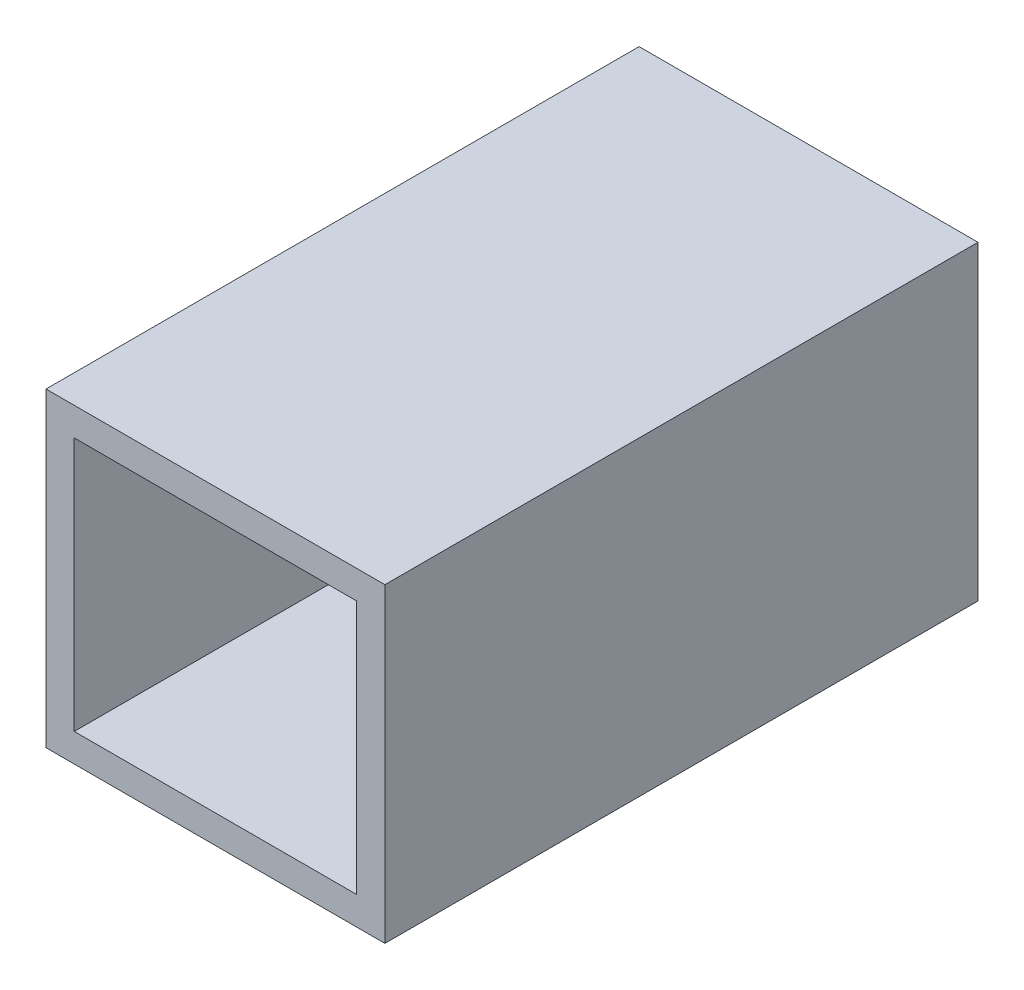
ISO-10303-21;
HEADER;
FILE_DESCRIPTION(('STEP AP214'),'2;1');
FILE_NAME('part.step','',(''),(''),'','','');
FILE_SCHEMA(('AUTOMOTIVE_DESIGN { 1 0 10303 214 1 1 1 1 }'));
ENDSEC;
DATA;
#1=APPLICATION_CONTEXT('core data for automotive mechanical design processes');
#2=APPLICATION_PROTOCOL_DEFINITION('international standard','automotive_design',2000,#1);
#3=PRODUCT_CONTEXT('',#1,'mechanical');
#4=PRODUCT('Part','Part','',(#3));
#5=PRODUCT_RELATED_PRODUCT_CATEGORY('part','',(#4));
#6=PRODUCT_DEFINITION_FORMATION('','',#4);
#7=PRODUCT_DEFINITION_CONTEXT('part definition',#1,'design');
#8=PRODUCT_DEFINITION('design','',#6,#7);
#9=PRODUCT_DEFINITION_SHAPE('','',#8);
#10=(LENGTH_UNIT() NAMED_UNIT(*) SI_UNIT(.MILLI.,.METRE.));
#11=(NAMED_UNIT(*) PLANE_ANGLE_UNIT() SI_UNIT($,.RADIAN.));
#12=(NAMED_UNIT(*) SI_UNIT($,.STERADIAN.) SOLID_ANGLE_UNIT());
#13=UNCERTAINTY_MEASURE_WITH_UNIT(LENGTH_MEASURE(1.E-05),#10,'distance_accuracy_value','');
#14=(GEOMETRIC_REPRESENTATION_CONTEXT(3) GLOBAL_UNCERTAINTY_ASSIGNED_CONTEXT((#13)) GLOBAL_UNIT_ASSIGNED_CONTEXT((#10,
#11,#12)) REPRESENTATION_CONTEXT('',''));
#15=CARTESIAN_POINT('',(0.,0.,0.));
#16=DIRECTION('',(0.,0.,1.));
#17=DIRECTION('',(1.,0.,0.));
#18=AXIS2_PLACEMENT_3D('',#15,#16,#17);
#19=CARTESIAN_POINT('',(25.,-22.5,-105.));
#20=DIRECTION('',(1.,0.,0.));
#21=DIRECTION('',(0.,0.,-1.));
#22=AXIS2_PLACEMENT_3D('',#19,#20,#21);
#23=PLANE('',#22);
#24=DIRECTION('',(0.,-1.,0.));
#25=VECTOR('',#24,1.);
#26=CARTESIAN_POINT('',(25.,-12.5,-100.));
#27=LINE('',#26,#25);
#28=CARTESIAN_POINT('',(25.,-12.5,-100.));
#29=VERTEX_POINT('',#28);
#30=CARTESIAN_POINT('',(25.,-22.5,-100.));
#31=VERTEX_POINT('',#30);
#32=EDGE_CURVE('E117',#29,#31,#27,.T.);
#33=ORIENTED_EDGE('',*,*,#32,.T.);
#34=DIRECTION('',(0.,0.,1.));
#35=VECTOR('',#34,1.);
#36=CARTESIAN_POINT('',(25.,-22.5,-105.));
#37=LINE('',#36,#35);
#38=CARTESIAN_POINT('',(25.,-22.5,0.));
#39=VERTEX_POINT('',#38);
#40=EDGE_CURVE('E150',#31,#39,#37,.T.);
#41=ORIENTED_EDGE('',*,*,#40,.T.);
#42=DIRECTION('',(0.,1.,0.));
#43=VECTOR('',#42,1.);
#44=CARTESIAN_POINT('',(25.,-22.5,0.));
#45=LINE('',#44,#43);
#46=CARTESIAN_POINT('',(25.,22.5,0.));
#47=VERTEX_POINT('',#46);
#48=EDGE_CURVE('E129',#39,#47,#45,.T.);
#49=ORIENTED_EDGE('',*,*,#48,.T.);
#50=DIRECTION('',(0.,0.,1.));
#51=VECTOR('',#50,1.);
#52=CARTESIAN_POINT('',(25.,22.5,-105.));
#53=LINE('',#52,#51);
#54=CARTESIAN_POINT('',(25.,22.5,-105.));
#55=VERTEX_POINT('',#54);
#56=EDGE_CURVE('E142',#55,#47,#53,.T.);
#57=ORIENTED_EDGE('',*,*,#56,.F.);
#58=DIRECTION('',(0.,1.,0.));
#59=VECTOR('',#58,1.);
#60=CARTESIAN_POINT('',(25.,-22.5,-105.));
#61=LINE('',#60,#59);
#62=CARTESIAN_POINT('',(25.,-12.5,-105.));
#63=VERTEX_POINT('',#62);
#64=EDGE_CURVE('E136',#63,#55,#61,.T.);
#65=ORIENTED_EDGE('',*,*,#64,.F.);
#66=DIRECTION('',(0.,0.,-1.));
#67=VECTOR('',#66,1.);
#68=CARTESIAN_POINT('',(25.,-12.5,-105.));
#69=LINE('',#68,#67);
#70=EDGE_CURVE('E119',#29,#63,#69,.T.);
#71=ORIENTED_EDGE('',*,*,#70,.F.);
#72=EDGE_LOOP('',(#33,#41,#49,#57,#65,#71));
#73=FACE_BOUND('',#72,.T.);
#74=ADVANCED_FACE('F33',(#73),#23,.F.);
#75=CARTESIAN_POINT('',(25.,-22.5,-105.));
#76=DIRECTION('',(0.,-1.,0.));
#77=DIRECTION('',(1.,0.,0.));
#78=AXIS2_PLACEMENT_3D('',#75,#76,#77);
#79=PLANE('',#78);
#80=DIRECTION('',(1.,0.,0.));
#81=VECTOR('',#80,1.);
#82=CARTESIAN_POINT('',(-25.,-22.5,-100.));
#83=LINE('',#82,#81);
#84=CARTESIAN_POINT('',(-25.,-22.5,-100.));
#85=VERTEX_POINT('',#84);
#86=EDGE_CURVE('E123',#85,#31,#83,.T.);
#87=ORIENTED_EDGE('',*,*,#86,.F.);
#88=DIRECTION('',(0.,0.,1.));
#89=VECTOR('',#88,1.);
#90=CARTESIAN_POINT('',(-25.,-22.5,-105.));
#91=LINE('',#90,#89);
#92=CARTESIAN_POINT('',(-25.,-22.5,0.));
#93=VERTEX_POINT('',#92);
#94=EDGE_CURVE('E128',#85,#93,#91,.T.);
#95=ORIENTED_EDGE('',*,*,#94,.T.);
#96=DIRECTION('',(1.,0.,0.));
#97=VECTOR('',#96,1.);
#98=CARTESIAN_POINT('',(25.,-22.5,0.));
#99=LINE('',#98,#97);
#100=EDGE_CURVE('E139',#93,#39,#99,.T.);
#101=ORIENTED_EDGE('',*,*,#100,.T.);
#102=ORIENTED_EDGE('',*,*,#40,.F.);
#103=EDGE_LOOP('',(#87,#95,#101,#102));
#104=FACE_BOUND('',#103,.T.);
#105=ADVANCED_FACE('F210',(#104),#79,.F.);
#106=CARTESIAN_POINT('',(-25.,-22.5,-105.));
#107=DIRECTION('',(-1.,0.,0.));
#108=DIRECTION('',(0.,0.,1.));
#109=AXIS2_PLACEMENT_3D('',#106,#107,#108);
#110=PLANE('',#109);
#111=DIRECTION('',(0.,-1.,0.));
#112=VECTOR('',#111,1.);
#113=CARTESIAN_POINT('',(-25.,-12.5,-100.));
#114=LINE('',#113,#112);
#115=CARTESIAN_POINT('',(-25.,-12.5,-100.));
#116=VERTEX_POINT('',#115);
#117=EDGE_CURVE('E114',#116,#85,#114,.T.);
#118=ORIENTED_EDGE('',*,*,#117,.F.);
#119=DIRECTION('',(0.,0.,1.));
#120=VECTOR('',#119,1.);
#121=CARTESIAN_POINT('',(-25.,-12.5,-105.));
#122=LINE('',#121,#120);
#123=CARTESIAN_POINT('',(-25.,-12.5,-105.));
#124=VERTEX_POINT('',#123);
#125=EDGE_CURVE('E120',#124,#116,#122,.T.);
#126=ORIENTED_EDGE('',*,*,#125,.F.);
#127=DIRECTION('',(0.,-1.,0.));
#128=VECTOR('',#127,1.);
#129=CARTESIAN_POINT('',(-25.,-22.5,-105.));
#130=LINE('',#129,#128);
#131=CARTESIAN_POINT('',(-25.,22.5,-105.));
#132=VERTEX_POINT('',#131);
#133=EDGE_CURVE('E57',#132,#124,#130,.T.);
#134=ORIENTED_EDGE('',*,*,#133,.F.);
#135=DIRECTION('',(0.,0.,1.));
#136=VECTOR('',#135,1.);
#137=CARTESIAN_POINT('',(-25.,22.5,-105.));
#138=LINE('',#137,#136);
#139=CARTESIAN_POINT('',(-25.,22.5,0.));
#140=VERTEX_POINT('',#139);
#141=EDGE_CURVE('E154',#132,#140,#138,.T.);
#142=ORIENTED_EDGE('',*,*,#141,.T.);
#143=DIRECTION('',(0.,-1.,0.));
#144=VECTOR('',#143,1.);
#145=CARTESIAN_POINT('',(-25.,-22.5,0.));
#146=LINE('',#145,#144);
#147=EDGE_CURVE('E146',#140,#93,#146,.T.);
#148=ORIENTED_EDGE('',*,*,#147,.T.);
#149=ORIENTED_EDGE('',*,*,#94,.F.);
#150=EDGE_LOOP('',(#118,#126,#134,#142,#148,#149));
#151=FACE_BOUND('',#150,.T.);
#152=ADVANCED_FACE('F126',(#151),#110,.F.);
#153=CARTESIAN_POINT('',(-30.,-27.5,-105.));
#154=DIRECTION('',(-1.,0.,0.));
#155=DIRECTION('',(0.,0.,1.));
#156=AXIS2_PLACEMENT_3D('',#153,#154,#155);
#157=PLANE('',#156);
#158=DIRECTION('',(0.,-1.,0.));
#159=VECTOR('',#158,1.);
#160=CARTESIAN_POINT('',(-30.,-27.5,0.));
#161=LINE('',#160,#159);
#162=CARTESIAN_POINT('',(-30.,27.5,0.));
#163=VERTEX_POINT('',#162);
#164=CARTESIAN_POINT('',(-30.,-27.5,0.));
#165=VERTEX_POINT('',#164);
#166=EDGE_CURVE('E152',#163,#165,#161,.T.);
#167=ORIENTED_EDGE('',*,*,#166,.F.);
#168=DIRECTION('',(0.,0.,1.));
#169=VECTOR('',#168,1.);
#170=CARTESIAN_POINT('',(-30.,27.5,-105.));
#171=LINE('',#170,#169);
#172=CARTESIAN_POINT('',(-30.,27.5,-105.));
#173=VERTEX_POINT('',#172);
#174=EDGE_CURVE('E11',#173,#163,#171,.T.);
#175=ORIENTED_EDGE('',*,*,#174,.F.);
#176=DIRECTION('',(0.,-1.,0.));
#177=VECTOR('',#176,1.);
#178=CARTESIAN_POINT('',(-30.,-27.5,-105.));
#179=LINE('',#178,#177);
#180=CARTESIAN_POINT('',(-30.,-27.5,-105.));
#181=VERTEX_POINT('',#180);
#182=EDGE_CURVE('E158',#173,#181,#179,.T.);
#183=ORIENTED_EDGE('',*,*,#182,.T.);
#184=DIRECTION('',(0.,0.,1.));
#185=VECTOR('',#184,1.);
#186=CARTESIAN_POINT('',(-30.,-27.5,-105.));
#187=LINE('',#186,#185);
#188=EDGE_CURVE('E37',#181,#165,#187,.T.);
#189=ORIENTED_EDGE('',*,*,#188,.T.);
#190=EDGE_LOOP('',(#167,#175,#183,#189));
#191=FACE_BOUND('',#190,.T.);
#192=ADVANCED_FACE('F35',(#191),#157,.T.);
#193=CARTESIAN_POINT('',(30.,27.5,-105.));
#194=DIRECTION('',(0.,1.,0.));
#195=DIRECTION('',(0.,0.,1.));
#196=AXIS2_PLACEMENT_3D('',#193,#194,#195);
#197=PLANE('',#196);
#198=DIRECTION('',(-1.,0.,0.));
#199=VECTOR('',#198,1.);
#200=CARTESIAN_POINT('',(30.,27.5,0.));
#201=LINE('',#200,#199);
#202=CARTESIAN_POINT('',(30.,27.5,0.));
#203=VERTEX_POINT('',#202);
#204=EDGE_CURVE('E162',#203,#163,#201,.T.);
#205=ORIENTED_EDGE('',*,*,#204,.F.);
#206=DIRECTION('',(0.,0.,1.));
#207=VECTOR('',#206,1.);
#208=CARTESIAN_POINT('',(30.,27.5,-105.));
#209=LINE('',#208,#207);
#210=CARTESIAN_POINT('',(30.,27.5,-105.));
#211=VERTEX_POINT('',#210);
#212=EDGE_CURVE('E42',#211,#203,#209,.T.);
#213=ORIENTED_EDGE('',*,*,#212,.F.);
#214=DIRECTION('',(-1.,0.,0.));
#215=VECTOR('',#214,1.);
#216=CARTESIAN_POINT('',(30.,27.5,-105.));
#217=LINE('',#216,#215);
#218=EDGE_CURVE('E168',#211,#173,#217,.T.);
#219=ORIENTED_EDGE('',*,*,#218,.T.);
#220=ORIENTED_EDGE('',*,*,#174,.T.);
#221=EDGE_LOOP('',(#205,#213,#219,#220));
#222=FACE_BOUND('',#221,.T.);
#223=ADVANCED_FACE('F194',(#222),#197,.T.);
#224=CARTESIAN_POINT('',(30.,-27.5,-105.));
#225=DIRECTION('',(1.,0.,0.));
#226=DIRECTION('',(0.,0.,-1.));
#227=AXIS2_PLACEMENT_3D('',#224,#225,#226);
#228=PLANE('',#227);
#229=DIRECTION('',(0.,1.,0.));
#230=VECTOR('',#229,1.);
#231=CARTESIAN_POINT('',(30.,-27.5,0.));
#232=LINE('',#231,#230);
#233=CARTESIAN_POINT('',(30.,-27.5,0.));
#234=VERTEX_POINT('',#233);
#235=EDGE_CURVE('E176',#234,#203,#232,.T.);
#236=ORIENTED_EDGE('',*,*,#235,.F.);
#237=DIRECTION('',(0.,0.,1.));
#238=VECTOR('',#237,1.);
#239=CARTESIAN_POINT('',(30.,-27.5,-105.));
#240=LINE('',#239,#238);
#241=CARTESIAN_POINT('',(30.,-27.5,-105.));
#242=VERTEX_POINT('',#241);
#243=EDGE_CURVE('E181',#242,#234,#240,.T.);
#244=ORIENTED_EDGE('',*,*,#243,.F.);
#245=DIRECTION('',(0.,1.,0.));
#246=VECTOR('',#245,1.);
#247=CARTESIAN_POINT('',(30.,-27.5,-105.));
#248=LINE('',#247,#246);
#249=EDGE_CURVE('E165',#242,#211,#248,.T.);
#250=ORIENTED_EDGE('',*,*,#249,.T.);
#251=ORIENTED_EDGE('',*,*,#212,.T.);
#252=EDGE_LOOP('',(#236,#244,#250,#251));
#253=FACE_BOUND('',#252,.T.);
#254=ADVANCED_FACE('F200',(#253),#228,.T.);
#255=CARTESIAN_POINT('',(30.,-27.5,-105.));
#256=DIRECTION('',(0.,-1.,0.));
#257=DIRECTION('',(1.,0.,0.));
#258=AXIS2_PLACEMENT_3D('',#255,#256,#257);
#259=PLANE('',#258);
#260=CARTESIAN_POINT('',(0.,-27.5,-52.5));
#261=DIRECTION('',(0.,-1.,0.));
#262=DIRECTION('',(1.,0.,0.));
#263=AXIS2_PLACEMENT_3D('',#260,#261,#262);
#264=CIRCLE('',#263,2.5);
#265=CARTESIAN_POINT('',(2.5,-27.5,-52.5));
#266=VERTEX_POINT('',#265);
#267=EDGE_CURVE('E243',#266,#266,#264,.T.);
#268=ORIENTED_EDGE('',*,*,#267,.F.);
#269=EDGE_LOOP('',(#268));
#270=FACE_BOUND('',#269,.T.);
#271=DIRECTION('',(1.,0.,0.));
#272=VECTOR('',#271,1.);
#273=CARTESIAN_POINT('',(30.,-27.5,0.));
#274=LINE('',#273,#272);
#275=EDGE_CURVE('E173',#165,#234,#274,.T.);
#276=ORIENTED_EDGE('',*,*,#275,.F.);
#277=ORIENTED_EDGE('',*,*,#188,.F.);
#278=DIRECTION('',(1.,0.,0.));
#279=VECTOR('',#278,1.);
#280=CARTESIAN_POINT('',(30.,-27.5,-105.));
#281=LINE('',#280,#279);
#282=EDGE_CURVE('E161',#181,#242,#281,.T.);
#283=ORIENTED_EDGE('',*,*,#282,.T.);
#284=ORIENTED_EDGE('',*,*,#243,.T.);
#285=EDGE_LOOP('',(#276,#277,#283,#284));
#286=FACE_BOUND('',#285,.T.);
#287=ADVANCED_FACE('F189',(#270,#286),#259,.T.);
#288=CARTESIAN_POINT('',(0.,0.,-105.));
#289=DIRECTION('',(0.,0.,1.));
#290=DIRECTION('',(1.,0.,0.));
#291=AXIS2_PLACEMENT_3D('',#288,#289,#290);
#292=PLANE('',#291);
#293=DIRECTION('',(-1.,0.,0.));
#294=VECTOR('',#293,1.);
#295=CARTESIAN_POINT('',(-25.,-12.5,-105.));
#296=LINE('',#295,#294);
#297=EDGE_CURVE('E50',#63,#124,#296,.T.);
#298=ORIENTED_EDGE('',*,*,#297,.F.);
#299=ORIENTED_EDGE('',*,*,#64,.T.);
#300=DIRECTION('',(-1.,0.,0.));
#301=VECTOR('',#300,1.);
#302=CARTESIAN_POINT('',(25.,22.5,-105.));
#303=LINE('',#302,#301);
#304=EDGE_CURVE('E138',#55,#132,#303,.T.);
#305=ORIENTED_EDGE('',*,*,#304,.T.);
#306=ORIENTED_EDGE('',*,*,#133,.T.);
#307=EDGE_LOOP('',(#298,#299,#305,#306));
#308=FACE_BOUND('',#307,.T.);
#309=ORIENTED_EDGE('',*,*,#182,.F.);
#310=ORIENTED_EDGE('',*,*,#218,.F.);
#311=ORIENTED_EDGE('',*,*,#249,.F.);
#312=ORIENTED_EDGE('',*,*,#282,.F.);
#313=EDGE_LOOP('',(#309,#310,#311,#312));
#314=FACE_BOUND('',#313,.T.);
#315=ADVANCED_FACE('F197',(#308,#314),#292,.F.);
#316=CARTESIAN_POINT('',(0.,0.,0.));
#317=DIRECTION('',(0.,0.,1.));
#318=DIRECTION('',(1.,0.,0.));
#319=AXIS2_PLACEMENT_3D('',#316,#317,#318);
#320=PLANE('',#319);
#321=ORIENTED_EDGE('',*,*,#48,.F.);
#322=ORIENTED_EDGE('',*,*,#100,.F.);
#323=ORIENTED_EDGE('',*,*,#147,.F.);
#324=DIRECTION('',(-1.,0.,0.));
#325=VECTOR('',#324,1.);
#326=CARTESIAN_POINT('',(25.,22.5,0.));
#327=LINE('',#326,#325);
#328=EDGE_CURVE('E131',#47,#140,#327,.T.);
#329=ORIENTED_EDGE('',*,*,#328,.F.);
#330=EDGE_LOOP('',(#321,#322,#323,#329));
#331=FACE_BOUND('',#330,.T.);
#332=ORIENTED_EDGE('',*,*,#166,.T.);
#333=ORIENTED_EDGE('',*,*,#275,.T.);
#334=ORIENTED_EDGE('',*,*,#235,.T.);
#335=ORIENTED_EDGE('',*,*,#204,.T.);
#336=EDGE_LOOP('',(#332,#333,#334,#335));
#337=FACE_BOUND('',#336,.T.);
#338=ADVANCED_FACE('F191',(#331,#337),#320,.T.);
#339=CARTESIAN_POINT('',(25.,22.5,-105.));
#340=DIRECTION('',(0.,1.,0.));
#341=DIRECTION('',(-1.,0.,0.));
#342=AXIS2_PLACEMENT_3D('',#339,#340,#341);
#343=PLANE('',#342);
#344=ORIENTED_EDGE('',*,*,#328,.T.);
#345=ORIENTED_EDGE('',*,*,#141,.F.);
#346=ORIENTED_EDGE('',*,*,#304,.F.);
#347=ORIENTED_EDGE('',*,*,#56,.T.);
#348=EDGE_LOOP('',(#344,#345,#346,#347));
#349=FACE_BOUND('',#348,.T.);
#350=ADVANCED_FACE('F220',(#349),#343,.F.);
#351=CARTESIAN_POINT('',(-25.,-12.5,-100.));
#352=DIRECTION('',(0.,0.,-1.));
#353=DIRECTION('',(-1.,0.,0.));
#354=AXIS2_PLACEMENT_3D('',#351,#352,#353);
#355=PLANE('',#354);
#356=ORIENTED_EDGE('',*,*,#86,.T.);
#357=ORIENTED_EDGE('',*,*,#32,.F.);
#358=DIRECTION('',(1.,0.,0.));
#359=VECTOR('',#358,1.);
#360=CARTESIAN_POINT('',(-25.,-12.5,-100.));
#361=LINE('',#360,#359);
#362=EDGE_CURVE('E111',#116,#29,#361,.T.);
#363=ORIENTED_EDGE('',*,*,#362,.F.);
#364=ORIENTED_EDGE('',*,*,#117,.T.);
#365=EDGE_LOOP('',(#356,#357,#363,#364));
#366=FACE_BOUND('',#365,.T.);
#367=ADVANCED_FACE('F112',(#366),#355,.F.);
#368=CARTESIAN_POINT('',(0.,-12.5,0.));
#369=DIRECTION('',(0.,1.,0.));
#370=DIRECTION('',(-1.,0.,0.));
#371=AXIS2_PLACEMENT_3D('',#368,#369,#370);
#372=PLANE('',#371);
#373=ORIENTED_EDGE('',*,*,#125,.T.);
#374=ORIENTED_EDGE('',*,*,#362,.T.);
#375=ORIENTED_EDGE('',*,*,#70,.T.);
#376=ORIENTED_EDGE('',*,*,#297,.T.);
#377=EDGE_LOOP('',(#373,#374,#375,#376));
#378=FACE_BOUND('',#377,.T.);
#379=ADVANCED_FACE('F122',(#378),#372,.T.);
#380=CARTESIAN_POINT('',(0.,-37.5,-52.5));
#381=DIRECTION('',(0.,1.,0.));
#382=DIRECTION('',(-1.,0.,0.));
#383=AXIS2_PLACEMENT_3D('',#380,#381,#382);
#384=CYLINDRICAL_SURFACE('',#383,2.5);
#385=CARTESIAN_POINT('',(0.,-37.5,-52.5));
#386=DIRECTION('',(0.,-1.,0.));
#387=DIRECTION('',(1.,0.,0.));
#388=AXIS2_PLACEMENT_3D('',#385,#386,#387);
#389=CIRCLE('',#388,2.5);
#390=CARTESIAN_POINT('',(2.5,-37.5,-52.5));
#391=VERTEX_POINT('',#390);
#392=EDGE_CURVE('E241',#391,#391,#389,.T.);
#393=ORIENTED_EDGE('',*,*,#392,.F.);
#394=EDGE_LOOP('',(#393));
#395=FACE_BOUND('',#394,.T.);
#396=ORIENTED_EDGE('',*,*,#267,.T.);
#397=EDGE_LOOP('',(#396));
#398=FACE_BOUND('',#397,.T.);
#399=ADVANCED_FACE('F251',(#395,#398),#384,.T.);
#400=CARTESIAN_POINT('',(0.,-37.5,-52.5));
#401=DIRECTION('',(0.,-1.,0.));
#402=DIRECTION('',(1.,0.,0.));
#403=AXIS2_PLACEMENT_3D('',#400,#401,#402);
#404=PLANE('',#403);
#405=ORIENTED_EDGE('',*,*,#392,.T.);
#406=EDGE_LOOP('',(#405));
#407=FACE_BOUND('',#406,.T.);
#408=ADVANCED_FACE('F253',(#407),#404,.T.);
#409=CLOSED_SHELL('',(#74,#105,#152,#192,#223,#254,#287,#315,#338,#350,#367,#379,#399,#408));
#410=MANIFOLD_SOLID_BREP('B2',#409);
#411=ADVANCED_BREP_SHAPE_REPRESENTATION('',(#18,#410),#14);
#412=SHAPE_DEFINITION_REPRESENTATION(#9,#411);
ENDSEC;
END-ISO-10303-21;
